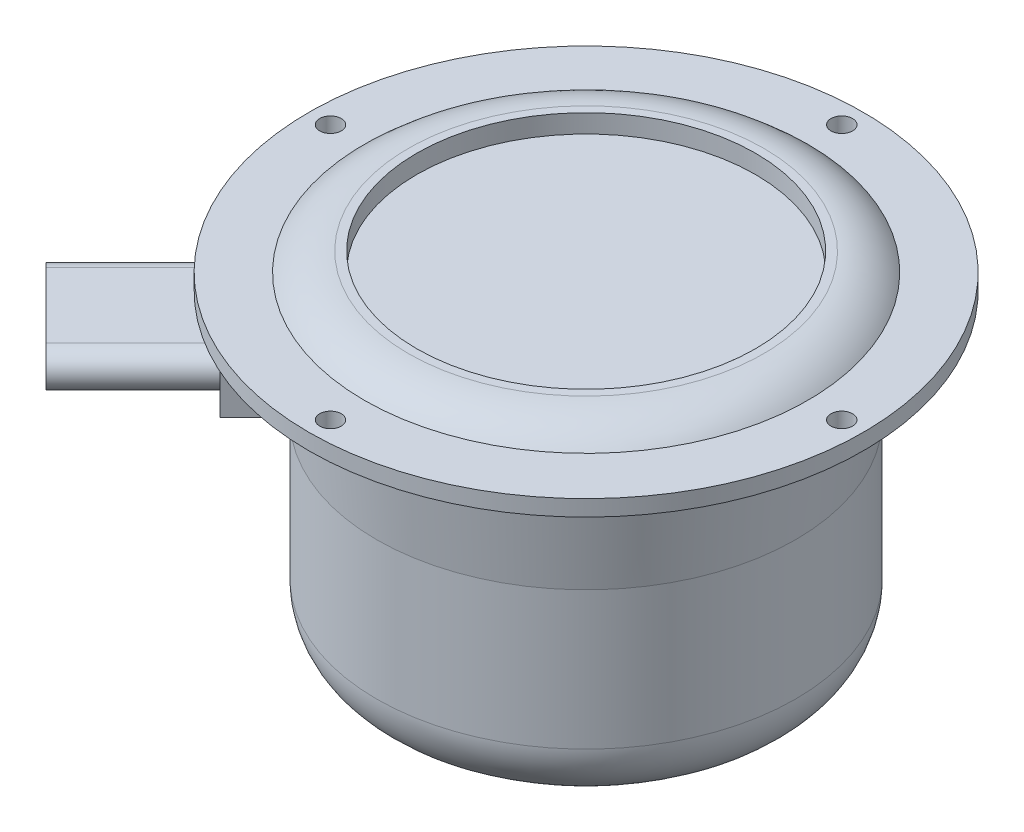
ISO-10303-21;
HEADER;
FILE_DESCRIPTION(('STEP AP214'),'2;1');
FILE_NAME('part.step','',(''),(''),'','','');
FILE_SCHEMA(('AUTOMOTIVE_DESIGN { 1 0 10303 214 1 1 1 1 }'));
ENDSEC;
DATA;
#1=APPLICATION_CONTEXT('core data for automotive mechanical design processes');
#2=APPLICATION_PROTOCOL_DEFINITION('international standard','automotive_design',2000,#1);
#3=PRODUCT_CONTEXT('',#1,'mechanical');
#4=PRODUCT('Part','Part','',(#3));
#5=PRODUCT_RELATED_PRODUCT_CATEGORY('part','',(#4));
#6=PRODUCT_DEFINITION_FORMATION('','',#4);
#7=PRODUCT_DEFINITION_CONTEXT('part definition',#1,'design');
#8=PRODUCT_DEFINITION('design','',#6,#7);
#9=PRODUCT_DEFINITION_SHAPE('','',#8);
#10=(LENGTH_UNIT() NAMED_UNIT(*) SI_UNIT(.MILLI.,.METRE.));
#11=(NAMED_UNIT(*) PLANE_ANGLE_UNIT() SI_UNIT($,.RADIAN.));
#12=(NAMED_UNIT(*) SI_UNIT($,.STERADIAN.) SOLID_ANGLE_UNIT());
#13=UNCERTAINTY_MEASURE_WITH_UNIT(LENGTH_MEASURE(1.E-05),#10,'distance_accuracy_value','');
#14=(GEOMETRIC_REPRESENTATION_CONTEXT(3) GLOBAL_UNCERTAINTY_ASSIGNED_CONTEXT((#13)) GLOBAL_UNIT_ASSIGNED_CONTEXT((#10,
#11,#12)) REPRESENTATION_CONTEXT('',''));
#15=CARTESIAN_POINT('',(0.,0.,0.));
#16=DIRECTION('',(0.,0.,1.));
#17=DIRECTION('',(1.,0.,0.));
#18=AXIS2_PLACEMENT_3D('',#15,#16,#17);
#19=CARTESIAN_POINT('',(-21.9203102167832,-10.,37.4766594028869));
#20=DIRECTION('',(0.707106781186552,0.,-0.707106781186544));
#21=DIRECTION('',(-0.707106781186544,0.,-0.707106781186551));
#22=AXIS2_PLACEMENT_3D('',#19,#20,#21);
#23=PLANE('',#22);
#24=DIRECTION('',(-0.707106781186544,0.,-0.707106781186552));
#25=VECTOR('',#24,1.);
#26=CARTESIAN_POINT('',(-21.9203102167832,0.,37.4766594028869));
#27=LINE('',#26,#25);
#28=CARTESIAN_POINT('',(-21.9203102167832,0.,37.4766594028869));
#29=VERTEX_POINT('',#28);
#30=CARTESIAN_POINT('',(-37.4766594028871,0.,21.9203102167828));
#31=VERTEX_POINT('',#30);
#32=EDGE_CURVE('E132',#29,#31,#27,.T.);
#33=ORIENTED_EDGE('',*,*,#32,.T.);
#34=DIRECTION('',(0.,1.,0.));
#35=VECTOR('',#34,1.);
#36=CARTESIAN_POINT('',(-37.4766594028871,-10.,21.9203102167828));
#37=LINE('',#36,#35);
#38=CARTESIAN_POINT('',(-37.4766594028871,-10.,21.9203102167828));
#39=VERTEX_POINT('',#38);
#40=EDGE_CURVE('E161',#39,#31,#37,.T.);
#41=ORIENTED_EDGE('',*,*,#40,.F.);
#42=DIRECTION('',(-0.707106781186544,0.,-0.707106781186552));
#43=VECTOR('',#42,1.);
#44=CARTESIAN_POINT('',(-21.9203102167832,-10.,37.4766594028869));
#45=LINE('',#44,#43);
#46=CARTESIAN_POINT('',(-21.9203102167832,-10.,37.4766594028869));
#47=VERTEX_POINT('',#46);
#48=EDGE_CURVE('E141',#47,#39,#45,.T.);
#49=ORIENTED_EDGE('',*,*,#48,.F.);
#50=DIRECTION('',(0.,1.,0.));
#51=VECTOR('',#50,1.);
#52=CARTESIAN_POINT('',(-21.9203102167832,-10.,37.4766594028869));
#53=LINE('',#52,#51);
#54=EDGE_CURVE('E164',#47,#29,#53,.T.);
#55=ORIENTED_EDGE('',*,*,#54,.T.);
#56=EDGE_LOOP('',(#33,#41,#49,#55));
#57=FACE_BOUND('',#56,.T.);
#58=CARTESIAN_POINT('',(-35.0017856687342,-5.,24.3951839509357));
#59=DIRECTION('',(-0.707106781186551,0.,0.707106781186544));
#60=DIRECTION('',(0.707106781186544,0.,0.707106781186551));
#61=AXIS2_PLACEMENT_3D('',#58,#59,#60);
#62=CIRCLE('',#61,3.);
#63=CARTESIAN_POINT('',(-35.0017856687342,-2.,24.3951839509357));
#64=VERTEX_POINT('',#63);
#65=CARTESIAN_POINT('',(-35.0017856687342,-8.00000000000001,24.3951839509357));
#66=VERTEX_POINT('',#65);
#67=EDGE_CURVE('E128',#64,#66,#62,.T.);
#68=ORIENTED_EDGE('',*,*,#67,.F.);
#69=DIRECTION('',(-0.707106781186544,0.,-0.707106781186551));
#70=VECTOR('',#69,1.);
#71=CARTESIAN_POINT('',(-35.0017856687342,-2.,24.3951839509357));
#72=LINE('',#71,#70);
#73=CARTESIAN_POINT('',(-24.3951839509361,-2.,35.001785668734));
#74=VERTEX_POINT('',#73);
#75=EDGE_CURVE('E125',#74,#64,#72,.T.);
#76=ORIENTED_EDGE('',*,*,#75,.F.);
#77=CARTESIAN_POINT('',(-24.3951839509361,-5.,35.001785668734));
#78=DIRECTION('',(-0.707106781186551,0.,0.707106781186544));
#79=DIRECTION('',(0.707106781186544,0.,0.707106781186551));
#80=AXIS2_PLACEMENT_3D('',#77,#78,#79);
#81=CIRCLE('',#80,3.);
#82=CARTESIAN_POINT('',(-24.3951839509361,-8.00000000000001,35.001785668734));
#83=VERTEX_POINT('',#82);
#84=EDGE_CURVE('E63',#83,#74,#81,.T.);
#85=ORIENTED_EDGE('',*,*,#84,.F.);
#86=DIRECTION('',(0.707106781186544,0.,0.707106781186551));
#87=VECTOR('',#86,1.);
#88=CARTESIAN_POINT('',(-35.0017856687342,-8.00000000000001,24.3951839509357));
#89=LINE('',#88,#87);
#90=EDGE_CURVE('E58',#66,#83,#89,.T.);
#91=ORIENTED_EDGE('',*,*,#90,.F.);
#92=EDGE_LOOP('',(#68,#76,#85,#91));
#93=FACE_BOUND('',#92,.T.);
#94=ADVANCED_FACE('F43',(#57,#93),#23,.F.);
#95=CARTESIAN_POINT('',(0.,0.,0.));
#96=DIRECTION('',(0.,1.,0.));
#97=DIRECTION('',(0.,0.,1.));
#98=AXIS2_PLACEMENT_3D('',#95,#96,#97);
#99=PLANE('',#98);
#100=CARTESIAN_POINT('',(0.,0.,41.5));
#101=DIRECTION('',(0.,1.,0.));
#102=DIRECTION('',(0.,0.,1.));
#103=AXIS2_PLACEMENT_3D('',#100,#101,#102);
#104=CIRCLE('',#103,1.75);
#105=CARTESIAN_POINT('',(0.,0.,43.25));
#106=VERTEX_POINT('',#105);
#107=EDGE_CURVE('E326',#106,#106,#104,.T.);
#108=ORIENTED_EDGE('',*,*,#107,.T.);
#109=EDGE_LOOP('',(#108));
#110=FACE_BOUND('',#109,.T.);
#111=CARTESIAN_POINT('',(0.,0.,-41.5));
#112=DIRECTION('',(0.,1.,0.));
#113=DIRECTION('',(0.,0.,1.));
#114=AXIS2_PLACEMENT_3D('',#111,#112,#113);
#115=CIRCLE('',#114,1.75);
#116=CARTESIAN_POINT('',(0.,0.,-39.75));
#117=VERTEX_POINT('',#116);
#118=EDGE_CURVE('E320',#117,#117,#115,.T.);
#119=ORIENTED_EDGE('',*,*,#118,.T.);
#120=EDGE_LOOP('',(#119));
#121=FACE_BOUND('',#120,.T.);
#122=CARTESIAN_POINT('',(-41.5,0.,0.));
#123=DIRECTION('',(0.,1.,0.));
#124=DIRECTION('',(0.,0.,1.));
#125=AXIS2_PLACEMENT_3D('',#122,#123,#124);
#126=CIRCLE('',#125,1.75);
#127=CARTESIAN_POINT('',(-41.5,0.,1.75));
#128=VERTEX_POINT('',#127);
#129=EDGE_CURVE('E314',#128,#128,#126,.T.);
#130=ORIENTED_EDGE('',*,*,#129,.T.);
#131=EDGE_LOOP('',(#130));
#132=FACE_BOUND('',#131,.T.);
#133=CARTESIAN_POINT('',(41.5,0.,0.));
#134=DIRECTION('',(0.,1.,0.));
#135=DIRECTION('',(0.,0.,1.));
#136=AXIS2_PLACEMENT_3D('',#133,#134,#135);
#137=CIRCLE('',#136,1.75);
#138=CARTESIAN_POINT('',(41.5,0.,1.75));
#139=VERTEX_POINT('',#138);
#140=EDGE_CURVE('E308',#139,#139,#137,.T.);
#141=ORIENTED_EDGE('',*,*,#140,.T.);
#142=EDGE_LOOP('',(#141));
#143=FACE_BOUND('',#142,.T.);
#144=CARTESIAN_POINT('',(0.,0.,0.));
#145=DIRECTION('',(0.,1.,0.));
#146=DIRECTION('',(0.,0.,1.));
#147=AXIS2_PLACEMENT_3D('',#144,#145,#146);
#148=CIRCLE('',#147,45.);
#149=CARTESIAN_POINT('',(0.,0.,45.));
#150=VERTEX_POINT('',#149);
#151=EDGE_CURVE('E302',#150,#150,#148,.T.);
#152=ORIENTED_EDGE('',*,*,#151,.F.);
#153=EDGE_LOOP('',(#152));
#154=FACE_BOUND('',#153,.T.);
#155=CARTESIAN_POINT('',(0.,0.,0.));
#156=DIRECTION('',(0.,-1.,0.));
#157=DIRECTION('',(0.,0.,-1.));
#158=AXIS2_PLACEMENT_3D('',#155,#156,#157);
#159=CIRCLE('',#158,35.5);
#160=CARTESIAN_POINT('',(0.,0.,-35.5));
#161=VERTEX_POINT('',#160);
#162=EDGE_CURVE('E291',#161,#161,#159,.T.);
#163=ORIENTED_EDGE('',*,*,#162,.F.);
#164=EDGE_LOOP('',(#163));
#165=FACE_BOUND('',#164,.T.);
#166=DIRECTION('',(-0.707106781186551,0.,0.707106781186544));
#167=VECTOR('',#166,1.);
#168=CARTESIAN_POINT('',(-21.9203102167832,0.,37.4766594028869));
#169=LINE('',#168,#167);
#170=CARTESIAN_POINT('',(-17.6776695296639,0.,33.2340187157676));
#171=VERTEX_POINT('',#170);
#172=EDGE_CURVE('E129',#171,#29,#169,.T.);
#173=ORIENTED_EDGE('',*,*,#172,.F.);
#174=DIRECTION('',(0.707106781186544,0.,0.707106781186552));
#175=VECTOR('',#174,1.);
#176=CARTESIAN_POINT('',(-17.6776695296639,0.,33.2340187157676));
#177=LINE('',#176,#175);
#178=CARTESIAN_POINT('',(-33.2340187157678,0.,17.6776695296635));
#179=VERTEX_POINT('',#178);
#180=EDGE_CURVE('E142',#179,#171,#177,.T.);
#181=ORIENTED_EDGE('',*,*,#180,.F.);
#182=DIRECTION('',(0.707106781186551,0.,-0.707106781186544));
#183=VECTOR('',#182,1.);
#184=CARTESIAN_POINT('',(-37.4766594028871,0.,21.9203102167828));
#185=LINE('',#184,#183);
#186=EDGE_CURVE('E151',#31,#179,#185,.T.);
#187=ORIENTED_EDGE('',*,*,#186,.F.);
#188=ORIENTED_EDGE('',*,*,#32,.F.);
#189=EDGE_LOOP('',(#173,#181,#187,#188));
#190=FACE_BOUND('',#189,.T.);
#191=ADVANCED_FACE('F211',(#110,#121,#132,#143,#154,#165,#190),#99,.F.);
#192=CARTESIAN_POINT('',(0.,2.6,0.));
#193=DIRECTION('',(0.,1.,0.));
#194=DIRECTION('',(0.,0.,1.));
#195=AXIS2_PLACEMENT_3D('',#192,#193,#194);
#196=PLANE('',#195);
#197=CARTESIAN_POINT('',(0.,2.6,0.));
#198=DIRECTION('',(0.,1.,0.));
#199=DIRECTION('',(0.,0.,1.));
#200=AXIS2_PLACEMENT_3D('',#197,#198,#199);
#201=CIRCLE('',#200,36.);
#202=CARTESIAN_POINT('',(0.,2.6,36.));
#203=VERTEX_POINT('',#202);
#204=EDGE_CURVE('E474',#203,#203,#201,.T.);
#205=ORIENTED_EDGE('',*,*,#204,.F.);
#206=EDGE_LOOP('',(#205));
#207=FACE_BOUND('',#206,.T.);
#208=CARTESIAN_POINT('',(0.,2.6,-41.5));
#209=DIRECTION('',(0.,1.,0.));
#210=DIRECTION('',(0.,0.,1.));
#211=AXIS2_PLACEMENT_3D('',#208,#209,#210);
#212=CIRCLE('',#211,1.75);
#213=CARTESIAN_POINT('',(0.,2.6,-39.75));
#214=VERTEX_POINT('',#213);
#215=EDGE_CURVE('E317',#214,#214,#212,.T.);
#216=ORIENTED_EDGE('',*,*,#215,.F.);
#217=EDGE_LOOP('',(#216));
#218=FACE_BOUND('',#217,.T.);
#219=CARTESIAN_POINT('',(41.5,2.6,0.));
#220=DIRECTION('',(0.,1.,0.));
#221=DIRECTION('',(0.,0.,1.));
#222=AXIS2_PLACEMENT_3D('',#219,#220,#221);
#223=CIRCLE('',#222,1.75);
#224=CARTESIAN_POINT('',(41.5,2.6,1.75));
#225=VERTEX_POINT('',#224);
#226=EDGE_CURVE('E305',#225,#225,#223,.T.);
#227=ORIENTED_EDGE('',*,*,#226,.F.);
#228=EDGE_LOOP('',(#227));
#229=FACE_BOUND('',#228,.T.);
#230=CARTESIAN_POINT('',(0.,2.6,0.));
#231=DIRECTION('',(0.,1.,0.));
#232=DIRECTION('',(0.,0.,1.));
#233=AXIS2_PLACEMENT_3D('',#230,#231,#232);
#234=CIRCLE('',#233,45.);
#235=CARTESIAN_POINT('',(0.,2.6,45.));
#236=VERTEX_POINT('',#235);
#237=EDGE_CURVE('E289',#236,#236,#234,.T.);
#238=ORIENTED_EDGE('',*,*,#237,.T.);
#239=EDGE_LOOP('',(#238));
#240=FACE_BOUND('',#239,.T.);
#241=CARTESIAN_POINT('',(-41.5,2.6,0.));
#242=DIRECTION('',(0.,1.,0.));
#243=DIRECTION('',(0.,0.,1.));
#244=AXIS2_PLACEMENT_3D('',#241,#242,#243);
#245=CIRCLE('',#244,1.75);
#246=CARTESIAN_POINT('',(-41.5,2.6,1.75));
#247=VERTEX_POINT('',#246);
#248=EDGE_CURVE('E311',#247,#247,#245,.T.);
#249=ORIENTED_EDGE('',*,*,#248,.F.);
#250=EDGE_LOOP('',(#249));
#251=FACE_BOUND('',#250,.T.);
#252=CARTESIAN_POINT('',(0.,2.6,41.5));
#253=DIRECTION('',(0.,1.,0.));
#254=DIRECTION('',(0.,0.,1.));
#255=AXIS2_PLACEMENT_3D('',#252,#253,#254);
#256=CIRCLE('',#255,1.75);
#257=CARTESIAN_POINT('',(0.,2.6,43.25));
#258=VERTEX_POINT('',#257);
#259=EDGE_CURVE('E323',#258,#258,#256,.T.);
#260=ORIENTED_EDGE('',*,*,#259,.F.);
#261=EDGE_LOOP('',(#260));
#262=FACE_BOUND('',#261,.T.);
#263=ADVANCED_FACE('F208',(#207,#218,#229,#240,#251,#262),#196,.T.);
#264=CARTESIAN_POINT('',(0.,2.6,0.));
#265=DIRECTION('',(0.,-1.,0.));
#266=DIRECTION('',(0.,0.,-1.));
#267=AXIS2_PLACEMENT_3D('',#264,#265,#266);
#268=CYLINDRICAL_SURFACE('',#267,45.);
#269=ORIENTED_EDGE('',*,*,#237,.F.);
#270=EDGE_LOOP('',(#269));
#271=FACE_BOUND('',#270,.T.);
#272=ORIENTED_EDGE('',*,*,#151,.T.);
#273=EDGE_LOOP('',(#272));
#274=FACE_BOUND('',#273,.T.);
#275=ADVANCED_FACE('F206',(#271,#274),#268,.T.);
#276=CARTESIAN_POINT('',(41.5,2.6,0.));
#277=DIRECTION('',(0.,-1.,0.));
#278=DIRECTION('',(0.,0.,-1.));
#279=AXIS2_PLACEMENT_3D('',#276,#277,#278);
#280=CYLINDRICAL_SURFACE('',#279,1.75);
#281=ORIENTED_EDGE('',*,*,#226,.T.);
#282=EDGE_LOOP('',(#281));
#283=FACE_BOUND('',#282,.T.);
#284=ORIENTED_EDGE('',*,*,#140,.F.);
#285=EDGE_LOOP('',(#284));
#286=FACE_BOUND('',#285,.T.);
#287=ADVANCED_FACE('F202',(#283,#286),#280,.F.);
#288=CARTESIAN_POINT('',(-41.5,2.6,0.));
#289=DIRECTION('',(0.,-1.,0.));
#290=DIRECTION('',(0.,0.,-1.));
#291=AXIS2_PLACEMENT_3D('',#288,#289,#290);
#292=CYLINDRICAL_SURFACE('',#291,1.75);
#293=ORIENTED_EDGE('',*,*,#248,.T.);
#294=EDGE_LOOP('',(#293));
#295=FACE_BOUND('',#294,.T.);
#296=ORIENTED_EDGE('',*,*,#129,.F.);
#297=EDGE_LOOP('',(#296));
#298=FACE_BOUND('',#297,.T.);
#299=ADVANCED_FACE('F198',(#295,#298),#292,.F.);
#300=CARTESIAN_POINT('',(0.,2.6,-41.5));
#301=DIRECTION('',(0.,-1.,0.));
#302=DIRECTION('',(0.,0.,-1.));
#303=AXIS2_PLACEMENT_3D('',#300,#301,#302);
#304=CYLINDRICAL_SURFACE('',#303,1.75);
#305=ORIENTED_EDGE('',*,*,#215,.T.);
#306=EDGE_LOOP('',(#305));
#307=FACE_BOUND('',#306,.T.);
#308=ORIENTED_EDGE('',*,*,#118,.F.);
#309=EDGE_LOOP('',(#308));
#310=FACE_BOUND('',#309,.T.);
#311=ADVANCED_FACE('F194',(#307,#310),#304,.F.);
#312=CARTESIAN_POINT('',(0.,2.6,41.5));
#313=DIRECTION('',(0.,-1.,0.));
#314=DIRECTION('',(0.,0.,-1.));
#315=AXIS2_PLACEMENT_3D('',#312,#313,#314);
#316=CYLINDRICAL_SURFACE('',#315,1.75);
#317=ORIENTED_EDGE('',*,*,#259,.T.);
#318=EDGE_LOOP('',(#317));
#319=FACE_BOUND('',#318,.T.);
#320=ORIENTED_EDGE('',*,*,#107,.F.);
#321=EDGE_LOOP('',(#320));
#322=FACE_BOUND('',#321,.T.);
#323=ADVANCED_FACE('F189',(#319,#322),#316,.F.);
#324=CARTESIAN_POINT('',(0.,-18.,0.));
#325=DIRECTION('',(0.,1.,0.));
#326=DIRECTION('',(0.,0.,1.));
#327=AXIS2_PLACEMENT_3D('',#324,#325,#326);
#328=CONICAL_SURFACE('',#327,34.,0.0831412318884413);
#329=CARTESIAN_POINT('',(0.,-18.,0.));
#330=DIRECTION('',(0.,-1.,0.));
#331=DIRECTION('',(0.,0.,-1.));
#332=AXIS2_PLACEMENT_3D('',#329,#330,#331);
#333=CIRCLE('',#332,34.);
#334=CARTESIAN_POINT('',(0.,-18.,-34.));
#335=VERTEX_POINT('',#334);
#336=EDGE_CURVE('E167',#335,#335,#333,.T.);
#337=ORIENTED_EDGE('',*,*,#336,.F.);
#338=EDGE_LOOP('',(#337));
#339=FACE_BOUND('',#338,.T.);
#340=ORIENTED_EDGE('',*,*,#162,.T.);
#341=EDGE_LOOP('',(#340));
#342=FACE_BOUND('',#341,.T.);
#343=ADVANCED_FACE('F178',(#339,#342),#328,.T.);
#344=CARTESIAN_POINT('',(0.,-50.4,0.));
#345=DIRECTION('',(0.,1.,0.));
#346=DIRECTION('',(0.,0.,1.));
#347=AXIS2_PLACEMENT_3D('',#344,#345,#346);
#348=CYLINDRICAL_SURFACE('',#347,34.);
#349=CARTESIAN_POINT('',(0.,-40.4,0.));
#350=DIRECTION('',(0.,-1.,0.));
#351=DIRECTION('',(0.,0.,-1.));
#352=AXIS2_PLACEMENT_3D('',#349,#350,#351);
#353=CIRCLE('',#352,34.);
#354=CARTESIAN_POINT('',(0.,-40.4,-34.));
#355=VERTEX_POINT('',#354);
#356=EDGE_CURVE('E282',#355,#355,#353,.F.);
#357=ORIENTED_EDGE('',*,*,#356,.T.);
#358=EDGE_LOOP('',(#357));
#359=FACE_BOUND('',#358,.T.);
#360=ORIENTED_EDGE('',*,*,#336,.T.);
#361=EDGE_LOOP('',(#360));
#362=FACE_BOUND('',#361,.T.);
#363=ADVANCED_FACE('F188',(#359,#362),#348,.T.);
#364=CARTESIAN_POINT('',(0.,-50.4,0.));
#365=DIRECTION('',(0.,-1.,0.));
#366=DIRECTION('',(0.,0.,-1.));
#367=AXIS2_PLACEMENT_3D('',#364,#365,#366);
#368=PLANE('',#367);
#369=CARTESIAN_POINT('',(0.,-50.4,0.));
#370=DIRECTION('',(0.,-1.,0.));
#371=DIRECTION('',(0.,0.,-1.));
#372=AXIS2_PLACEMENT_3D('',#369,#370,#371);
#373=CIRCLE('',#372,24.);
#374=CARTESIAN_POINT('',(0.,-50.4,-24.));
#375=VERTEX_POINT('',#374);
#376=EDGE_CURVE('E284',#375,#375,#373,.T.);
#377=ORIENTED_EDGE('',*,*,#376,.T.);
#378=EDGE_LOOP('',(#377));
#379=FACE_BOUND('',#378,.T.);
#380=ADVANCED_FACE('F222',(#379),#368,.T.);
#381=CARTESIAN_POINT('',(0.,-40.4,0.));
#382=DIRECTION('',(0.,-1.,0.));
#383=DIRECTION('',(0.,0.,-1.));
#384=AXIS2_PLACEMENT_3D('',#381,#382,#383);
#385=TOROIDAL_SURFACE('',#384,24.,10.);
#386=ORIENTED_EDGE('',*,*,#356,.F.);
#387=EDGE_LOOP('',(#386));
#388=FACE_BOUND('',#387,.T.);
#389=ORIENTED_EDGE('',*,*,#376,.F.);
#390=EDGE_LOOP('',(#389));
#391=FACE_BOUND('',#390,.T.);
#392=ADVANCED_FACE('F219',(#388,#391),#385,.T.);
#393=CARTESIAN_POINT('',(-21.9203102167832,-10.,37.4766594028869));
#394=DIRECTION('',(-0.707106781186544,0.,-0.707106781186551));
#395=DIRECTION('',(-0.707106781186551,0.,0.707106781186544));
#396=AXIS2_PLACEMENT_3D('',#393,#394,#395);
#397=PLANE('',#396);
#398=ORIENTED_EDGE('',*,*,#172,.T.);
#399=ORIENTED_EDGE('',*,*,#54,.F.);
#400=DIRECTION('',(-0.707106781186551,0.,0.707106781186544));
#401=VECTOR('',#400,1.);
#402=CARTESIAN_POINT('',(-21.9203102167832,-10.,37.4766594028869));
#403=LINE('',#402,#401);
#404=CARTESIAN_POINT('',(-17.6776695296639,-10.,33.2340187157676));
#405=VERTEX_POINT('',#404);
#406=EDGE_CURVE('E138',#405,#47,#403,.T.);
#407=ORIENTED_EDGE('',*,*,#406,.F.);
#408=DIRECTION('',(0.,1.,0.));
#409=VECTOR('',#408,1.);
#410=CARTESIAN_POINT('',(-17.6776695296639,-10.,33.2340187157676));
#411=LINE('',#410,#409);
#412=EDGE_CURVE('E147',#405,#171,#411,.T.);
#413=ORIENTED_EDGE('',*,*,#412,.T.);
#414=EDGE_LOOP('',(#398,#399,#407,#413));
#415=FACE_BOUND('',#414,.T.);
#416=ADVANCED_FACE('F221',(#415),#397,.F.);
#417=CARTESIAN_POINT('',(-37.4766594028871,-10.,21.9203102167828));
#418=DIRECTION('',(0.707106781186544,0.,0.707106781186551));
#419=DIRECTION('',(0.707106781186551,0.,-0.707106781186544));
#420=AXIS2_PLACEMENT_3D('',#417,#418,#419);
#421=PLANE('',#420);
#422=ORIENTED_EDGE('',*,*,#186,.T.);
#423=DIRECTION('',(0.,1.,0.));
#424=VECTOR('',#423,1.);
#425=CARTESIAN_POINT('',(-33.2340187157678,-10.,17.6776695296635));
#426=LINE('',#425,#424);
#427=CARTESIAN_POINT('',(-33.2340187157678,-10.,17.6776695296635));
#428=VERTEX_POINT('',#427);
#429=EDGE_CURVE('E158',#428,#179,#426,.T.);
#430=ORIENTED_EDGE('',*,*,#429,.F.);
#431=DIRECTION('',(0.707106781186551,0.,-0.707106781186544));
#432=VECTOR('',#431,1.);
#433=CARTESIAN_POINT('',(-37.4766594028871,-10.,21.9203102167828));
#434=LINE('',#433,#432);
#435=EDGE_CURVE('E144',#39,#428,#434,.T.);
#436=ORIENTED_EDGE('',*,*,#435,.F.);
#437=ORIENTED_EDGE('',*,*,#40,.T.);
#438=EDGE_LOOP('',(#422,#430,#436,#437));
#439=FACE_BOUND('',#438,.T.);
#440=ADVANCED_FACE('F228',(#439),#421,.F.);
#441=CARTESIAN_POINT('',(-17.6776695296639,-10.,33.2340187157676));
#442=DIRECTION('',(-0.707106781186551,0.,0.707106781186544));
#443=DIRECTION('',(0.707106781186544,0.,0.707106781186551));
#444=AXIS2_PLACEMENT_3D('',#441,#442,#443);
#445=PLANE('',#444);
#446=ORIENTED_EDGE('',*,*,#180,.T.);
#447=ORIENTED_EDGE('',*,*,#412,.F.);
#448=DIRECTION('',(0.707106781186544,0.,0.707106781186552));
#449=VECTOR('',#448,1.);
#450=CARTESIAN_POINT('',(-17.6776695296639,-10.,33.2340187157676));
#451=LINE('',#450,#449);
#452=EDGE_CURVE('E146',#428,#405,#451,.T.);
#453=ORIENTED_EDGE('',*,*,#452,.F.);
#454=ORIENTED_EDGE('',*,*,#429,.T.);
#455=EDGE_LOOP('',(#446,#447,#453,#454));
#456=FACE_BOUND('',#455,.T.);
#457=ADVANCED_FACE('F244',(#456),#445,.F.);
#458=CARTESIAN_POINT('',(0.,-10.,0.));
#459=DIRECTION('',(0.,1.,0.));
#460=DIRECTION('',(0.,0.,1.));
#461=AXIS2_PLACEMENT_3D('',#458,#459,#460);
#462=PLANE('',#461);
#463=ORIENTED_EDGE('',*,*,#406,.T.);
#464=ORIENTED_EDGE('',*,*,#48,.T.);
#465=ORIENTED_EDGE('',*,*,#435,.T.);
#466=ORIENTED_EDGE('',*,*,#452,.T.);
#467=EDGE_LOOP('',(#463,#464,#465,#466));
#468=FACE_BOUND('',#467,.T.);
#469=ADVANCED_FACE('F248',(#468),#462,.F.);
#470=CARTESIAN_POINT('',(-49.1439212924653,-5.,38.5373195746666));
#471=DIRECTION('',(0.707106781186551,0.,-0.707106781186544));
#472=DIRECTION('',(-0.707106781186544,0.,-0.707106781186551));
#473=AXIS2_PLACEMENT_3D('',#470,#471,#472);
#474=CYLINDRICAL_SURFACE('',#473,3.);
#475=ORIENTED_EDGE('',*,*,#67,.T.);
#476=DIRECTION('',(0.707106781186551,0.,-0.707106781186544));
#477=VECTOR('',#476,1.);
#478=CARTESIAN_POINT('',(-49.1439212924653,-8.00000000000001,38.5373195746666));
#479=LINE('',#478,#477);
#480=CARTESIAN_POINT('',(-49.1439212924653,-8.00000000000001,38.5373195746666));
#481=VERTEX_POINT('',#480);
#482=EDGE_CURVE('E109',#481,#66,#479,.T.);
#483=ORIENTED_EDGE('',*,*,#482,.F.);
#484=CARTESIAN_POINT('',(-49.1439212924653,-5.,38.5373195746666));
#485=DIRECTION('',(-0.707106781186551,0.,0.707106781186544));
#486=DIRECTION('',(0.707106781186544,0.,0.707106781186551));
#487=AXIS2_PLACEMENT_3D('',#484,#485,#486);
#488=CIRCLE('',#487,3.);
#489=CARTESIAN_POINT('',(-49.1439212924653,-2.,38.5373195746666));
#490=VERTEX_POINT('',#489);
#491=EDGE_CURVE('E116',#490,#481,#488,.T.);
#492=ORIENTED_EDGE('',*,*,#491,.F.);
#493=DIRECTION('',(0.707106781186551,0.,-0.707106781186544));
#494=VECTOR('',#493,1.);
#495=CARTESIAN_POINT('',(-49.1439212924653,-2.,38.5373195746666));
#496=LINE('',#495,#494);
#497=EDGE_CURVE('E482',#490,#64,#496,.T.);
#498=ORIENTED_EDGE('',*,*,#497,.T.);
#499=EDGE_LOOP('',(#475,#483,#492,#498));
#500=FACE_BOUND('',#499,.T.);
#501=ADVANCED_FACE('F127',(#500),#474,.T.);
#502=CARTESIAN_POINT('',(-49.1439212924653,-8.00000000000001,38.5373195746666));
#503=DIRECTION('',(0.,1.,0.));
#504=DIRECTION('',(0.,0.,1.));
#505=AXIS2_PLACEMENT_3D('',#502,#503,#504);
#506=PLANE('',#505);
#507=ORIENTED_EDGE('',*,*,#90,.T.);
#508=DIRECTION('',(0.707106781186551,0.,-0.707106781186544));
#509=VECTOR('',#508,1.);
#510=CARTESIAN_POINT('',(-38.5373195746671,-8.00000000000001,49.1439212924648));
#511=LINE('',#510,#509);
#512=CARTESIAN_POINT('',(-38.5373195746671,-8.00000000000001,49.1439212924648));
#513=VERTEX_POINT('',#512);
#514=EDGE_CURVE('E112',#513,#83,#511,.T.);
#515=ORIENTED_EDGE('',*,*,#514,.F.);
#516=DIRECTION('',(0.707106781186544,0.,0.707106781186551));
#517=VECTOR('',#516,1.);
#518=CARTESIAN_POINT('',(-49.1439212924653,-8.00000000000001,38.5373195746666));
#519=LINE('',#518,#517);
#520=EDGE_CURVE('E105',#481,#513,#519,.T.);
#521=ORIENTED_EDGE('',*,*,#520,.F.);
#522=ORIENTED_EDGE('',*,*,#482,.T.);
#523=EDGE_LOOP('',(#507,#515,#521,#522));
#524=FACE_BOUND('',#523,.T.);
#525=ADVANCED_FACE('F107',(#524),#506,.F.);
#526=CARTESIAN_POINT('',(-38.5373195746671,-5.,49.1439212924648));
#527=DIRECTION('',(0.707106781186551,0.,-0.707106781186544));
#528=DIRECTION('',(-0.707106781186544,0.,-0.707106781186551));
#529=AXIS2_PLACEMENT_3D('',#526,#527,#528);
#530=CYLINDRICAL_SURFACE('',#529,3.);
#531=ORIENTED_EDGE('',*,*,#84,.T.);
#532=DIRECTION('',(0.707106781186551,0.,-0.707106781186544));
#533=VECTOR('',#532,1.);
#534=CARTESIAN_POINT('',(-38.5373195746671,-2.,49.1439212924648));
#535=LINE('',#534,#533);
#536=CARTESIAN_POINT('',(-38.5373195746671,-2.,49.1439212924648));
#537=VERTEX_POINT('',#536);
#538=EDGE_CURVE('E134',#537,#74,#535,.T.);
#539=ORIENTED_EDGE('',*,*,#538,.F.);
#540=CARTESIAN_POINT('',(-38.5373195746671,-5.,49.1439212924648));
#541=DIRECTION('',(-0.707106781186551,0.,0.707106781186544));
#542=DIRECTION('',(0.707106781186544,0.,0.707106781186551));
#543=AXIS2_PLACEMENT_3D('',#540,#541,#542);
#544=CIRCLE('',#543,3.);
#545=EDGE_CURVE('E115',#513,#537,#544,.T.);
#546=ORIENTED_EDGE('',*,*,#545,.F.);
#547=ORIENTED_EDGE('',*,*,#514,.T.);
#548=EDGE_LOOP('',(#531,#539,#546,#547));
#549=FACE_BOUND('',#548,.T.);
#550=ADVANCED_FACE('F255',(#549),#530,.T.);
#551=CARTESIAN_POINT('',(-49.1439212924653,-2.,38.5373195746666));
#552=DIRECTION('',(0.,-1.,0.));
#553=DIRECTION('',(0.,0.,-1.));
#554=AXIS2_PLACEMENT_3D('',#551,#552,#553);
#555=PLANE('',#554);
#556=ORIENTED_EDGE('',*,*,#75,.T.);
#557=ORIENTED_EDGE('',*,*,#497,.F.);
#558=DIRECTION('',(-0.707106781186544,0.,-0.707106781186551));
#559=VECTOR('',#558,1.);
#560=CARTESIAN_POINT('',(-49.1439212924653,-2.,38.5373195746666));
#561=LINE('',#560,#559);
#562=EDGE_CURVE('E121',#537,#490,#561,.T.);
#563=ORIENTED_EDGE('',*,*,#562,.F.);
#564=ORIENTED_EDGE('',*,*,#538,.T.);
#565=EDGE_LOOP('',(#556,#557,#563,#564));
#566=FACE_BOUND('',#565,.T.);
#567=ADVANCED_FACE('F258',(#566),#555,.F.);
#568=CARTESIAN_POINT('',(-49.1439212924653,-5.,38.5373195746666));
#569=DIRECTION('',(-0.707106781186551,0.,0.707106781186544));
#570=DIRECTION('',(0.707106781186544,0.,0.707106781186551));
#571=AXIS2_PLACEMENT_3D('',#568,#569,#570);
#572=PLANE('',#571);
#573=ORIENTED_EDGE('',*,*,#491,.T.);
#574=ORIENTED_EDGE('',*,*,#520,.T.);
#575=ORIENTED_EDGE('',*,*,#545,.T.);
#576=ORIENTED_EDGE('',*,*,#562,.T.);
#577=EDGE_LOOP('',(#573,#574,#575,#576));
#578=FACE_BOUND('',#577,.T.);
#579=ADVANCED_FACE('F119',(#578),#572,.T.);
#580=CARTESIAN_POINT('',(0.,5.6,0.));
#581=DIRECTION('',(0.,1.,0.));
#582=DIRECTION('',(0.,0.,1.));
#583=AXIS2_PLACEMENT_3D('',#580,#581,#582);
#584=PLANE('',#583);
#585=CARTESIAN_POINT('',(0.,5.6,0.));
#586=DIRECTION('',(0.,1.,0.));
#587=DIRECTION('',(0.,0.,1.));
#588=AXIS2_PLACEMENT_3D('',#585,#586,#587);
#589=CIRCLE('',#588,28.8585715714572);
#590=CARTESIAN_POINT('',(0.,5.6,28.8585715714572));
#591=VERTEX_POINT('',#590);
#592=EDGE_CURVE('E12',#591,#591,#589,.T.);
#593=ORIENTED_EDGE('',*,*,#592,.T.);
#594=EDGE_LOOP('',(#593));
#595=FACE_BOUND('',#594,.T.);
#596=CARTESIAN_POINT('',(0.,5.6,0.));
#597=DIRECTION('',(0.,1.,0.));
#598=DIRECTION('',(0.,0.,1.));
#599=AXIS2_PLACEMENT_3D('',#596,#597,#598);
#600=CIRCLE('',#599,27.5);
#601=CARTESIAN_POINT('',(0.,5.6,27.5));
#602=VERTEX_POINT('',#601);
#603=EDGE_CURVE('E279',#602,#602,#600,.T.);
#604=ORIENTED_EDGE('',*,*,#603,.F.);
#605=EDGE_LOOP('',(#604));
#606=FACE_BOUND('',#605,.T.);
#607=ADVANCED_FACE('F265',(#595,#606),#584,.T.);
#608=CARTESIAN_POINT('',(0.,5.6,0.));
#609=DIRECTION('',(0.,-1.,0.));
#610=DIRECTION('',(0.,0.,-1.));
#611=AXIS2_PLACEMENT_3D('',#608,#609,#610);
#612=CYLINDRICAL_SURFACE('',#611,27.5);
#613=ORIENTED_EDGE('',*,*,#603,.T.);
#614=EDGE_LOOP('',(#613));
#615=FACE_BOUND('',#614,.T.);
#616=CARTESIAN_POINT('',(0.,2.6,0.));
#617=DIRECTION('',(0.,1.,0.));
#618=DIRECTION('',(0.,0.,1.));
#619=AXIS2_PLACEMENT_3D('',#616,#617,#618);
#620=CIRCLE('',#619,27.5);
#621=CARTESIAN_POINT('',(0.,2.6,27.5));
#622=VERTEX_POINT('',#621);
#623=EDGE_CURVE('E51',#622,#622,#620,.F.);
#624=ORIENTED_EDGE('',*,*,#623,.T.);
#625=EDGE_LOOP('',(#624));
#626=FACE_BOUND('',#625,.T.);
#627=ADVANCED_FACE('F268',(#615,#626),#612,.F.);
#628=ORIENTED_EDGE('',*,*,#623,.F.);
#629=EDGE_LOOP('',(#628));
#630=FACE_BOUND('',#629,.T.);
#631=ADVANCED_FACE('F213',(#630),#196,.T.);
#632=CARTESIAN_POINT('',(0.,-4.4,0.));
#633=DIRECTION('',(0.,-1.,0.));
#634=DIRECTION('',(0.,0.,-1.));
#635=AXIS2_PLACEMENT_3D('',#632,#633,#634);
#636=TOROIDAL_SURFACE('',#635,28.8585715714572,10.);
#637=ORIENTED_EDGE('',*,*,#204,.T.);
#638=EDGE_LOOP('',(#637));
#639=FACE_BOUND('',#638,.T.);
#640=ORIENTED_EDGE('',*,*,#592,.F.);
#641=EDGE_LOOP('',(#640));
#642=FACE_BOUND('',#641,.T.);
#643=ADVANCED_FACE('F45',(#639,#642),#636,.T.);
#644=CLOSED_SHELL('',(#94,#191,#263,#275,#287,#299,#311,#323,#343,#363,#380,#392,#416,#440,#457,
#469,#501,#525,#550,#567,#579,#607,#627,#631,#643));
#645=MANIFOLD_SOLID_BREP('B2',#644);
#646=ADVANCED_BREP_SHAPE_REPRESENTATION('',(#18,#645),#14);
#647=SHAPE_DEFINITION_REPRESENTATION(#9,#646);
ENDSEC;
END-ISO-10303-21;
